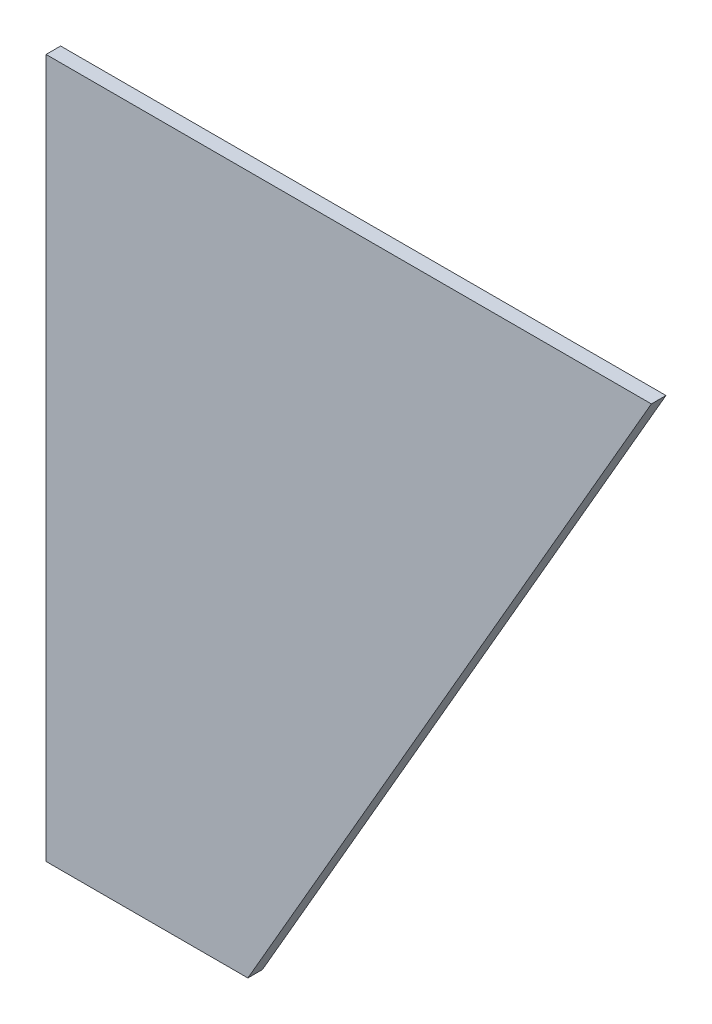
ISO-10303-21;
HEADER;
FILE_DESCRIPTION(('STEP AP214'),'2;1');
FILE_NAME('part.step','',(''),(''),'','','');
FILE_SCHEMA(('AUTOMOTIVE_DESIGN { 1 0 10303 214 1 1 1 1 }'));
ENDSEC;
DATA;
#1=APPLICATION_CONTEXT('core data for automotive mechanical design processes');
#2=APPLICATION_PROTOCOL_DEFINITION('international standard','automotive_design',2000,#1);
#3=PRODUCT_CONTEXT('',#1,'mechanical');
#4=PRODUCT('Part','Part','',(#3));
#5=PRODUCT_RELATED_PRODUCT_CATEGORY('part','',(#4));
#6=PRODUCT_DEFINITION_FORMATION('','',#4);
#7=PRODUCT_DEFINITION_CONTEXT('part definition',#1,'design');
#8=PRODUCT_DEFINITION('design','',#6,#7);
#9=PRODUCT_DEFINITION_SHAPE('','',#8);
#10=(LENGTH_UNIT() NAMED_UNIT(*) SI_UNIT(.MILLI.,.METRE.));
#11=(NAMED_UNIT(*) PLANE_ANGLE_UNIT() SI_UNIT($,.RADIAN.));
#12=(NAMED_UNIT(*) SI_UNIT($,.STERADIAN.) SOLID_ANGLE_UNIT());
#13=UNCERTAINTY_MEASURE_WITH_UNIT(LENGTH_MEASURE(1.E-05),#10,'distance_accuracy_value','');
#14=(GEOMETRIC_REPRESENTATION_CONTEXT(3) GLOBAL_UNCERTAINTY_ASSIGNED_CONTEXT((#13)) GLOBAL_UNIT_ASSIGNED_CONTEXT((#10,
#11,#12)) REPRESENTATION_CONTEXT('',''));
#15=CARTESIAN_POINT('',(0.,0.,0.));
#16=DIRECTION('',(0.,0.,1.));
#17=DIRECTION('',(1.,0.,0.));
#18=AXIS2_PLACEMENT_3D('',#15,#16,#17);
#19=CARTESIAN_POINT('',(-104.681201716738,-49.6751072961373,3.));
#20=DIRECTION('',(1.,0.,0.));
#21=DIRECTION('',(0.,0.,-1.));
#22=AXIS2_PLACEMENT_3D('',#19,#20,#21);
#23=PLANE('',#22);
#24=DIRECTION('',(0.,-1.,0.));
#25=VECTOR('',#24,1.);
#26=CARTESIAN_POINT('',(-104.681201716738,-49.6751072961373,0.));
#27=LINE('',#26,#25);
#28=CARTESIAN_POINT('',(-104.681201716738,94.0348927038627,0.));
#29=VERTEX_POINT('',#28);
#30=CARTESIAN_POINT('',(-104.681201716738,-49.6751072961373,0.));
#31=VERTEX_POINT('',#30);
#32=EDGE_CURVE('E72',#29,#31,#27,.T.);
#33=ORIENTED_EDGE('',*,*,#32,.T.);
#34=DIRECTION('',(0.,0.,-1.));
#35=VECTOR('',#34,1.);
#36=CARTESIAN_POINT('',(-104.681201716738,-49.6751072961373,3.));
#37=LINE('',#36,#35);
#38=CARTESIAN_POINT('',(-104.681201716738,-49.6751072961373,3.));
#39=VERTEX_POINT('',#38);
#40=EDGE_CURVE('E11',#39,#31,#37,.T.);
#41=ORIENTED_EDGE('',*,*,#40,.F.);
#42=DIRECTION('',(0.,-1.,0.));
#43=VECTOR('',#42,1.);
#44=CARTESIAN_POINT('',(-104.681201716738,74.0348927038627,3.));
#45=LINE('',#44,#43);
#46=CARTESIAN_POINT('',(-104.681201716738,94.0348927038627,3.));
#47=VERTEX_POINT('',#46);
#48=EDGE_CURVE('E77',#47,#39,#45,.T.);
#49=ORIENTED_EDGE('',*,*,#48,.F.);
#50=DIRECTION('',(0.,0.,-1.));
#51=VECTOR('',#50,1.);
#52=CARTESIAN_POINT('',(-104.681201716738,94.0348927038627,3.));
#53=LINE('',#52,#51);
#54=EDGE_CURVE('E93',#47,#29,#53,.T.);
#55=ORIENTED_EDGE('',*,*,#54,.T.);
#56=EDGE_LOOP('',(#33,#41,#49,#55));
#57=FACE_BOUND('',#56,.T.);
#58=ADVANCED_FACE('F33',(#57),#23,.F.);
#59=CARTESIAN_POINT('',(-63.1812017167382,-49.6751072961373,3.));
#60=DIRECTION('',(0.,1.,0.));
#61=DIRECTION('',(-1.,0.,0.));
#62=AXIS2_PLACEMENT_3D('',#59,#60,#61);
#63=PLANE('',#62);
#64=DIRECTION('',(1.,0.,0.));
#65=VECTOR('',#64,1.);
#66=CARTESIAN_POINT('',(-63.1812017167382,-49.6751072961373,0.));
#67=LINE('',#66,#65);
#68=CARTESIAN_POINT('',(-63.1812017167382,-49.6751072961373,0.));
#69=VERTEX_POINT('',#68);
#70=EDGE_CURVE('E89',#31,#69,#67,.T.);
#71=ORIENTED_EDGE('',*,*,#70,.T.);
#72=DIRECTION('',(0.,0.,-1.));
#73=VECTOR('',#72,1.);
#74=CARTESIAN_POINT('',(-63.1812017167382,-49.6751072961373,3.));
#75=LINE('',#74,#73);
#76=CARTESIAN_POINT('',(-63.1812017167382,-49.6751072961373,3.));
#77=VERTEX_POINT('',#76);
#78=EDGE_CURVE('E41',#77,#69,#75,.T.);
#79=ORIENTED_EDGE('',*,*,#78,.F.);
#80=DIRECTION('',(1.,0.,0.));
#81=VECTOR('',#80,1.);
#82=CARTESIAN_POINT('',(-63.1812017167382,-49.6751072961373,3.));
#83=LINE('',#82,#81);
#84=EDGE_CURVE('E80',#39,#77,#83,.T.);
#85=ORIENTED_EDGE('',*,*,#84,.F.);
#86=ORIENTED_EDGE('',*,*,#40,.T.);
#87=EDGE_LOOP('',(#71,#79,#85,#86));
#88=FACE_BOUND('',#87,.T.);
#89=ADVANCED_FACE('F88',(#88),#63,.F.);
#90=CARTESIAN_POINT('',(8.23879828326177,74.0348927038627,3.));
#91=DIRECTION('',(-0.866037534291528,0.499978988756778,0.));
#92=DIRECTION('',(-0.499978988756778,-0.866037534291528,0.));
#93=AXIS2_PLACEMENT_3D('',#90,#91,#92);
#94=PLANE('',#93);
#95=DIRECTION('',(0.499978988756778,0.866037534291528,0.));
#96=VECTOR('',#95,1.);
#97=CARTESIAN_POINT('',(8.23879828326177,74.0348927038627,0.));
#98=LINE('',#97,#96);
#99=CARTESIAN_POINT('',(19.7851567021446,94.0348927038627,0.));
#100=VERTEX_POINT('',#99);
#101=EDGE_CURVE('E65',#69,#100,#98,.T.);
#102=ORIENTED_EDGE('',*,*,#101,.T.);
#103=DIRECTION('',(0.,0.,-1.));
#104=VECTOR('',#103,1.);
#105=CARTESIAN_POINT('',(19.7851567021446,94.0348927038627,3.));
#106=LINE('',#105,#104);
#107=CARTESIAN_POINT('',(19.7851567021446,94.0348927038627,3.));
#108=VERTEX_POINT('',#107);
#109=EDGE_CURVE('E90',#108,#100,#106,.T.);
#110=ORIENTED_EDGE('',*,*,#109,.F.);
#111=DIRECTION('',(0.499978988756778,0.866037534291528,0.));
#112=VECTOR('',#111,1.);
#113=CARTESIAN_POINT('',(8.23879828326177,74.0348927038627,3.));
#114=LINE('',#113,#112);
#115=EDGE_CURVE('E84',#77,#108,#114,.T.);
#116=ORIENTED_EDGE('',*,*,#115,.F.);
#117=ORIENTED_EDGE('',*,*,#78,.T.);
#118=EDGE_LOOP('',(#102,#110,#116,#117));
#119=FACE_BOUND('',#118,.T.);
#120=ADVANCED_FACE('F91',(#119),#94,.F.);
#121=CARTESIAN_POINT('',(-104.681201716738,94.0348927038627,3.));
#122=DIRECTION('',(0.,-1.,0.));
#123=DIRECTION('',(0.,0.,-1.));
#124=AXIS2_PLACEMENT_3D('',#121,#122,#123);
#125=PLANE('',#124);
#126=DIRECTION('',(-1.,0.,0.));
#127=VECTOR('',#126,1.);
#128=CARTESIAN_POINT('',(-104.681201716738,94.0348927038627,0.));
#129=LINE('',#128,#127);
#130=EDGE_CURVE('E100',#100,#29,#129,.T.);
#131=ORIENTED_EDGE('',*,*,#130,.T.);
#132=ORIENTED_EDGE('',*,*,#54,.F.);
#133=DIRECTION('',(-1.,0.,0.));
#134=VECTOR('',#133,1.);
#135=CARTESIAN_POINT('',(-104.681201716738,94.0348927038627,3.));
#136=LINE('',#135,#134);
#137=EDGE_CURVE('E49',#108,#47,#136,.T.);
#138=ORIENTED_EDGE('',*,*,#137,.F.);
#139=ORIENTED_EDGE('',*,*,#109,.T.);
#140=EDGE_LOOP('',(#131,#132,#138,#139));
#141=FACE_BOUND('',#140,.T.);
#142=ADVANCED_FACE('F105',(#141),#125,.F.);
#143=CARTESIAN_POINT('',(0.,0.,3.));
#144=DIRECTION('',(0.,0.,-1.));
#145=DIRECTION('',(-1.,0.,0.));
#146=AXIS2_PLACEMENT_3D('',#143,#144,#145);
#147=PLANE('',#146);
#148=ORIENTED_EDGE('',*,*,#48,.T.);
#149=ORIENTED_EDGE('',*,*,#84,.T.);
#150=ORIENTED_EDGE('',*,*,#115,.T.);
#151=ORIENTED_EDGE('',*,*,#137,.T.);
#152=EDGE_LOOP('',(#148,#149,#150,#151));
#153=FACE_BOUND('',#152,.T.);
#154=ADVANCED_FACE('F82',(#153),#147,.F.);
#155=CARTESIAN_POINT('',(0.,0.,0.));
#156=DIRECTION('',(0.,0.,-1.));
#157=DIRECTION('',(-1.,0.,0.));
#158=AXIS2_PLACEMENT_3D('',#155,#156,#157);
#159=PLANE('',#158);
#160=ORIENTED_EDGE('',*,*,#32,.F.);
#161=ORIENTED_EDGE('',*,*,#130,.F.);
#162=ORIENTED_EDGE('',*,*,#101,.F.);
#163=ORIENTED_EDGE('',*,*,#70,.F.);
#164=EDGE_LOOP('',(#160,#161,#162,#163));
#165=FACE_BOUND('',#164,.T.);
#166=ADVANCED_FACE('F106',(#165),#159,.T.);
#167=CLOSED_SHELL('',(#58,#89,#120,#142,#154,#166));
#168=MANIFOLD_SOLID_BREP('B2',#167);
#169=ADVANCED_BREP_SHAPE_REPRESENTATION('',(#18,#168),#14);
#170=SHAPE_DEFINITION_REPRESENTATION(#9,#169);
ENDSEC;
END-ISO-10303-21;
